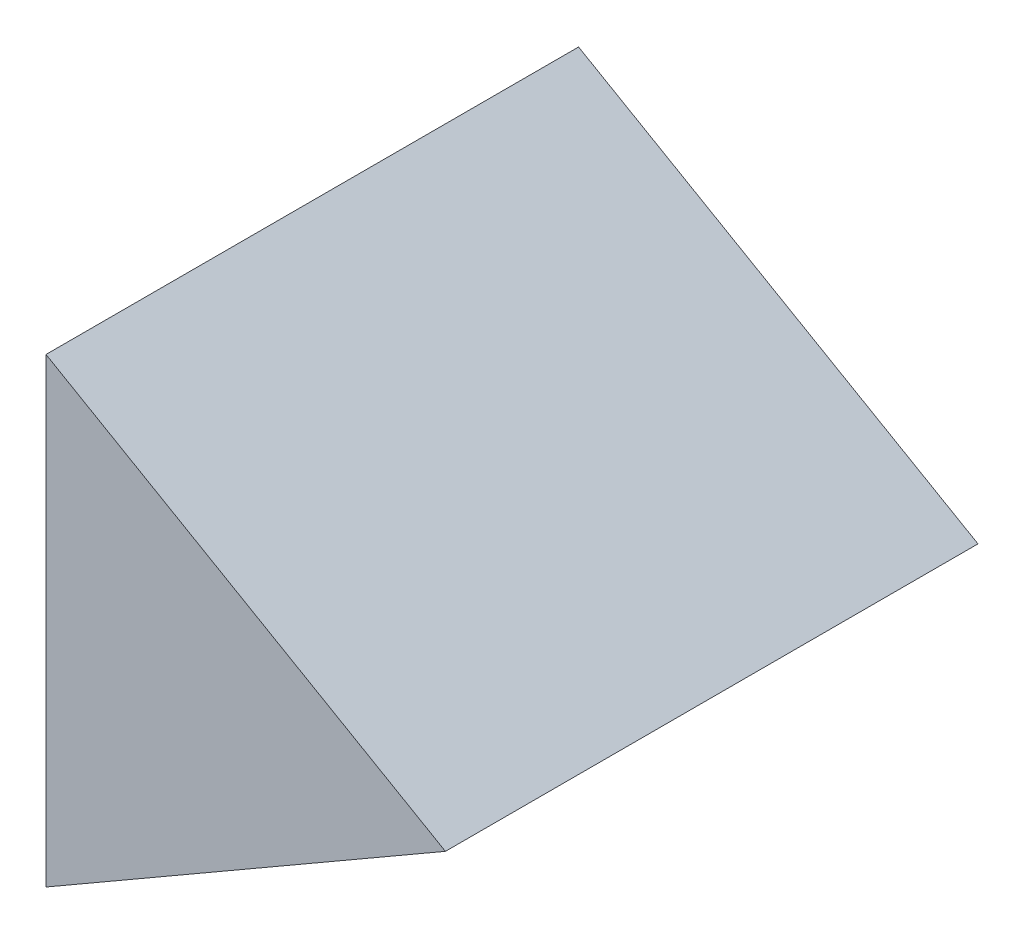
ISO-10303-21;
HEADER;
FILE_DESCRIPTION(('STEP AP214'),'2;1');
FILE_NAME('part.step','',(''),(''),'','','');
FILE_SCHEMA(('AUTOMOTIVE_DESIGN { 1 0 10303 214 1 1 1 1 }'));
ENDSEC;
DATA;
#1=APPLICATION_CONTEXT('core data for automotive mechanical design processes');
#2=APPLICATION_PROTOCOL_DEFINITION('international standard','automotive_design',2000,#1);
#3=PRODUCT_CONTEXT('',#1,'mechanical');
#4=PRODUCT('Part','Part','',(#3));
#5=PRODUCT_RELATED_PRODUCT_CATEGORY('part','',(#4));
#6=PRODUCT_DEFINITION_FORMATION('','',#4);
#7=PRODUCT_DEFINITION_CONTEXT('part definition',#1,'design');
#8=PRODUCT_DEFINITION('design','',#6,#7);
#9=PRODUCT_DEFINITION_SHAPE('','',#8);
#10=(LENGTH_UNIT() NAMED_UNIT(*) SI_UNIT(.MILLI.,.METRE.));
#11=(NAMED_UNIT(*) PLANE_ANGLE_UNIT() SI_UNIT($,.RADIAN.));
#12=(NAMED_UNIT(*) SI_UNIT($,.STERADIAN.) SOLID_ANGLE_UNIT());
#13=UNCERTAINTY_MEASURE_WITH_UNIT(LENGTH_MEASURE(1.E-05),#10,'distance_accuracy_value','');
#14=(GEOMETRIC_REPRESENTATION_CONTEXT(3) GLOBAL_UNCERTAINTY_ASSIGNED_CONTEXT((#13)) GLOBAL_UNIT_ASSIGNED_CONTEXT((#10,
#11,#12)) REPRESENTATION_CONTEXT('',''));
#15=CARTESIAN_POINT('',(0.,0.,0.));
#16=DIRECTION('',(0.,0.,1.));
#17=DIRECTION('',(1.,0.,0.));
#18=AXIS2_PLACEMENT_3D('',#15,#16,#17);
#19=CARTESIAN_POINT('',(-249.999999999996,-433.012701892222,1000.));
#20=DIRECTION('',(-0.500000000000004,0.866025403784436,0.));
#21=DIRECTION('',(-0.866025403784436,-0.500000000000004,0.));
#22=AXIS2_PLACEMENT_3D('',#19,#20,#21);
#23=PLANE('',#22);
#24=DIRECTION('',(0.866025403784436,0.500000000000004,0.));
#25=VECTOR('',#24,1.);
#26=CARTESIAN_POINT('',(-249.999999999996,-433.012701892222,0.));
#27=LINE('',#26,#25);
#28=CARTESIAN_POINT('',(-249.999999999996,-433.012701892222,0.));
#29=VERTEX_POINT('',#28);
#30=CARTESIAN_POINT('',(500.,0.,0.));
#31=VERTEX_POINT('',#30);
#32=EDGE_CURVE('E88',#29,#31,#27,.T.);
#33=ORIENTED_EDGE('',*,*,#32,.T.);
#34=DIRECTION('',(0.,0.,-1.));
#35=VECTOR('',#34,1.);
#36=CARTESIAN_POINT('',(500.,0.,1000.));
#37=LINE('',#36,#35);
#38=CARTESIAN_POINT('',(500.,0.,1000.));
#39=VERTEX_POINT('',#38);
#40=EDGE_CURVE('E11',#39,#31,#37,.T.);
#41=ORIENTED_EDGE('',*,*,#40,.F.);
#42=DIRECTION('',(0.866025403784436,0.500000000000004,0.));
#43=VECTOR('',#42,1.);
#44=CARTESIAN_POINT('',(-249.999999999996,-433.012701892222,1000.));
#45=LINE('',#44,#43);
#46=CARTESIAN_POINT('',(-249.999999999996,-433.012701892222,1000.));
#47=VERTEX_POINT('',#46);
#48=EDGE_CURVE('E81',#47,#39,#45,.T.);
#49=ORIENTED_EDGE('',*,*,#48,.F.);
#50=DIRECTION('',(0.,0.,-1.));
#51=VECTOR('',#50,1.);
#52=CARTESIAN_POINT('',(-249.999999999996,-433.012701892222,1000.));
#53=LINE('',#52,#51);
#54=EDGE_CURVE('E89',#47,#29,#53,.T.);
#55=ORIENTED_EDGE('',*,*,#54,.T.);
#56=EDGE_LOOP('',(#33,#41,#49,#55));
#57=FACE_BOUND('',#56,.T.);
#58=ADVANCED_FACE('F41',(#57),#23,.F.);
#59=CARTESIAN_POINT('',(500.,0.,1000.));
#60=DIRECTION('',(-0.499999999999998,-0.86602540378444,0.));
#61=DIRECTION('',(0.86602540378444,-0.499999999999998,0.));
#62=AXIS2_PLACEMENT_3D('',#59,#60,#61);
#63=PLANE('',#62);
#64=DIRECTION('',(-0.86602540378444,0.499999999999998,0.));
#65=VECTOR('',#64,1.);
#66=CARTESIAN_POINT('',(500.,0.,0.));
#67=LINE('',#66,#65);
#68=CARTESIAN_POINT('',(-250.000000000002,433.012701892218,0.));
#69=VERTEX_POINT('',#68);
#70=EDGE_CURVE('E69',#31,#69,#67,.T.);
#71=ORIENTED_EDGE('',*,*,#70,.T.);
#72=DIRECTION('',(0.,0.,-1.));
#73=VECTOR('',#72,1.);
#74=CARTESIAN_POINT('',(-250.000000000002,433.012701892218,1000.));
#75=LINE('',#74,#73);
#76=CARTESIAN_POINT('',(-250.000000000002,433.012701892218,1000.));
#77=VERTEX_POINT('',#76);
#78=EDGE_CURVE('E49',#77,#69,#75,.T.);
#79=ORIENTED_EDGE('',*,*,#78,.F.);
#80=DIRECTION('',(-0.86602540378444,0.499999999999998,0.));
#81=VECTOR('',#80,1.);
#82=CARTESIAN_POINT('',(500.,0.,1000.));
#83=LINE('',#82,#81);
#84=EDGE_CURVE('E77',#39,#77,#83,.T.);
#85=ORIENTED_EDGE('',*,*,#84,.F.);
#86=ORIENTED_EDGE('',*,*,#40,.T.);
#87=EDGE_LOOP('',(#71,#79,#85,#86));
#88=FACE_BOUND('',#87,.T.);
#89=ADVANCED_FACE('F78',(#88),#63,.F.);
#90=CARTESIAN_POINT('',(-250.000000000002,433.012701892218,1000.));
#91=DIRECTION('',(1.,0.,0.));
#92=DIRECTION('',(0.,1.,0.));
#93=AXIS2_PLACEMENT_3D('',#90,#91,#92);
#94=PLANE('',#93);
#95=DIRECTION('',(0.,-1.,0.));
#96=VECTOR('',#95,1.);
#97=CARTESIAN_POINT('',(-250.000000000002,433.012701892218,0.));
#98=LINE('',#97,#96);
#99=EDGE_CURVE('E74',#69,#29,#98,.T.);
#100=ORIENTED_EDGE('',*,*,#99,.T.);
#101=ORIENTED_EDGE('',*,*,#54,.F.);
#102=DIRECTION('',(0.,-1.,0.));
#103=VECTOR('',#102,1.);
#104=CARTESIAN_POINT('',(-250.000000000002,433.012701892218,1000.));
#105=LINE('',#104,#103);
#106=EDGE_CURVE('E57',#77,#47,#105,.T.);
#107=ORIENTED_EDGE('',*,*,#106,.F.);
#108=ORIENTED_EDGE('',*,*,#78,.T.);
#109=EDGE_LOOP('',(#100,#101,#107,#108));
#110=FACE_BOUND('',#109,.T.);
#111=ADVANCED_FACE('F96',(#110),#94,.F.);
#112=CARTESIAN_POINT('',(0.,0.,1000.));
#113=DIRECTION('',(0.,0.,1.));
#114=DIRECTION('',(1.,0.,0.));
#115=AXIS2_PLACEMENT_3D('',#112,#113,#114);
#116=PLANE('',#115);
#117=ORIENTED_EDGE('',*,*,#48,.T.);
#118=ORIENTED_EDGE('',*,*,#84,.T.);
#119=ORIENTED_EDGE('',*,*,#106,.T.);
#120=EDGE_LOOP('',(#117,#118,#119));
#121=FACE_BOUND('',#120,.T.);
#122=ADVANCED_FACE('F84',(#121),#116,.T.);
#123=CARTESIAN_POINT('',(0.,0.,0.));
#124=DIRECTION('',(0.,0.,1.));
#125=DIRECTION('',(1.,0.,0.));
#126=AXIS2_PLACEMENT_3D('',#123,#124,#125);
#127=PLANE('',#126);
#128=ORIENTED_EDGE('',*,*,#32,.F.);
#129=ORIENTED_EDGE('',*,*,#99,.F.);
#130=ORIENTED_EDGE('',*,*,#70,.F.);
#131=EDGE_LOOP('',(#128,#129,#130));
#132=FACE_BOUND('',#131,.T.);
#133=ADVANCED_FACE('F97',(#132),#127,.F.);
#134=CLOSED_SHELL('',(#58,#89,#111,#122,#133));
#135=MANIFOLD_SOLID_BREP('B2',#134);
#136=ADVANCED_BREP_SHAPE_REPRESENTATION('',(#18,#135),#14);
#137=SHAPE_DEFINITION_REPRESENTATION(#9,#136);
ENDSEC;
END-ISO-10303-21;
